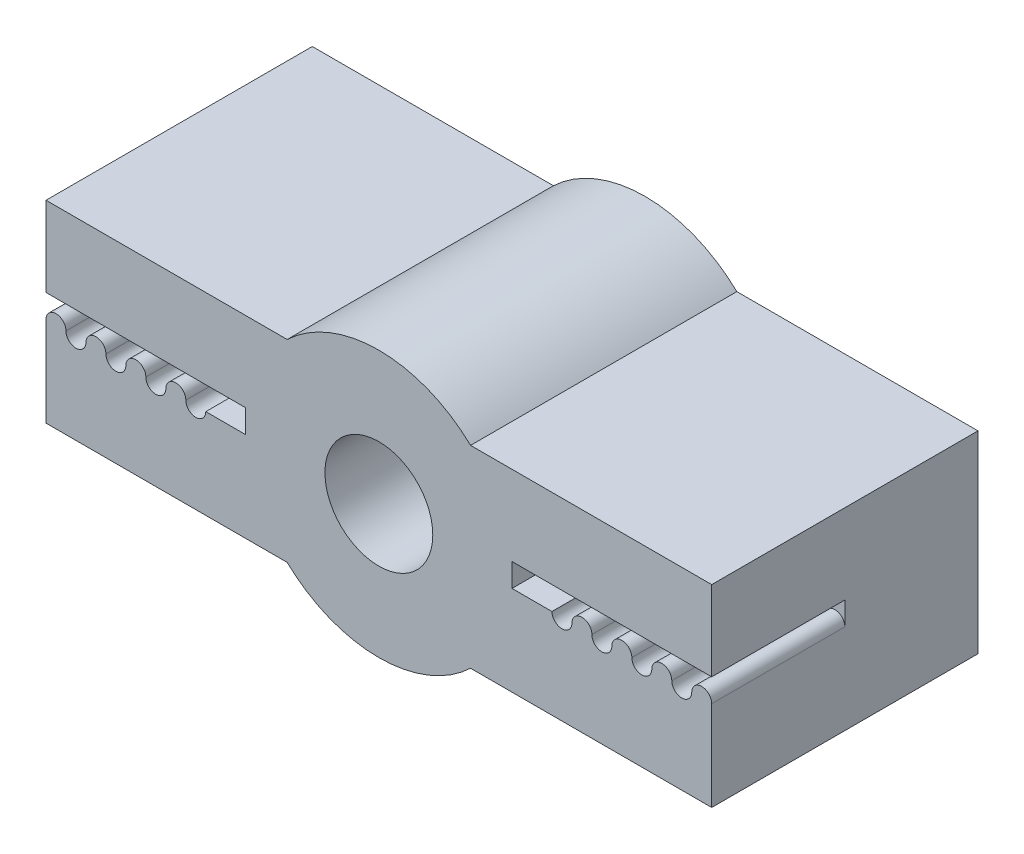
ISO-10303-21;
HEADER;
FILE_DESCRIPTION(('STEP AP214'),'2;1');
FILE_NAME('part.step','',(''),(''),'','','');
FILE_SCHEMA(('AUTOMOTIVE_DESIGN { 1 0 10303 214 1 1 1 1 }'));
ENDSEC;
DATA;
#1=APPLICATION_CONTEXT('core data for automotive mechanical design processes');
#2=APPLICATION_PROTOCOL_DEFINITION('international standard','automotive_design',2000,#1);
#3=PRODUCT_CONTEXT('',#1,'mechanical');
#4=PRODUCT('Part','Part','',(#3));
#5=PRODUCT_RELATED_PRODUCT_CATEGORY('part','',(#4));
#6=PRODUCT_DEFINITION_FORMATION('','',#4);
#7=PRODUCT_DEFINITION_CONTEXT('part definition',#1,'design');
#8=PRODUCT_DEFINITION('design','',#6,#7);
#9=PRODUCT_DEFINITION_SHAPE('','',#8);
#10=(LENGTH_UNIT() NAMED_UNIT(*) SI_UNIT(.MILLI.,.METRE.));
#11=(NAMED_UNIT(*) PLANE_ANGLE_UNIT() SI_UNIT($,.RADIAN.));
#12=(NAMED_UNIT(*) SI_UNIT($,.STERADIAN.) SOLID_ANGLE_UNIT());
#13=UNCERTAINTY_MEASURE_WITH_UNIT(LENGTH_MEASURE(1.E-05),#10,'distance_accuracy_value','');
#14=(GEOMETRIC_REPRESENTATION_CONTEXT(3) GLOBAL_UNCERTAINTY_ASSIGNED_CONTEXT((#13)) GLOBAL_UNIT_ASSIGNED_CONTEXT((#10,
#11,#12)) REPRESENTATION_CONTEXT('',''));
#15=CARTESIAN_POINT('',(0.,0.,0.));
#16=DIRECTION('',(0.,0.,1.));
#17=DIRECTION('',(1.,0.,0.));
#18=AXIS2_PLACEMENT_3D('',#15,#16,#17);
#19=CARTESIAN_POINT('',(45.,8.75000000000001,35.));
#20=DIRECTION('',(-1.,0.,0.));
#21=DIRECTION('',(0.,0.,1.));
#22=AXIS2_PLACEMENT_3D('',#19,#20,#21);
#23=PLANE('',#22);
#24=DIRECTION('',(0.,0.,1.));
#25=VECTOR('',#24,1.);
#26=CARTESIAN_POINT('',(45.,15.5,25.));
#27=LINE('',#26,#25);
#28=CARTESIAN_POINT('',(45.,15.5,25.));
#29=VERTEX_POINT('',#28);
#30=CARTESIAN_POINT('',(45.,15.5,35.));
#31=VERTEX_POINT('',#30);
#32=EDGE_CURVE('E383',#29,#31,#27,.T.);
#33=ORIENTED_EDGE('',*,*,#32,.T.);
#34=DIRECTION('',(0.,1.,0.));
#35=VECTOR('',#34,1.);
#36=CARTESIAN_POINT('',(45.,8.75000000000001,35.));
#37=LINE('',#36,#35);
#38=CARTESIAN_POINT('',(45.,8.75000000000001,35.));
#39=VERTEX_POINT('',#38);
#40=EDGE_CURVE('E449',#39,#31,#37,.T.);
#41=ORIENTED_EDGE('',*,*,#40,.F.);
#42=DIRECTION('',(0.,0.,-1.));
#43=VECTOR('',#42,1.);
#44=CARTESIAN_POINT('',(45.,8.75000000000001,35.));
#45=LINE('',#44,#43);
#46=CARTESIAN_POINT('',(45.,8.75000000000001,15.));
#47=VERTEX_POINT('',#46);
#48=EDGE_CURVE('E43',#39,#47,#45,.T.);
#49=ORIENTED_EDGE('',*,*,#48,.T.);
#50=DIRECTION('',(0.,1.,0.));
#51=VECTOR('',#50,1.);
#52=CARTESIAN_POINT('',(45.,8.75000000000001,15.));
#53=LINE('',#52,#51);
#54=CARTESIAN_POINT('',(45.,23.25,15.));
#55=VERTEX_POINT('',#54);
#56=EDGE_CURVE('E469',#47,#55,#53,.T.);
#57=ORIENTED_EDGE('',*,*,#56,.T.);
#58=DIRECTION('',(0.,0.,-1.));
#59=VECTOR('',#58,1.);
#60=CARTESIAN_POINT('',(45.,23.25,35.));
#61=LINE('',#60,#59);
#62=CARTESIAN_POINT('',(45.,23.25,35.));
#63=VERTEX_POINT('',#62);
#64=EDGE_CURVE('E494',#63,#55,#61,.T.);
#65=ORIENTED_EDGE('',*,*,#64,.F.);
#66=CARTESIAN_POINT('',(45.,17.25,35.));
#67=VERTEX_POINT('',#66);
#68=EDGE_CURVE('E448',#67,#63,#37,.T.);
#69=ORIENTED_EDGE('',*,*,#68,.F.);
#70=DIRECTION('',(0.,0.,1.));
#71=VECTOR('',#70,1.);
#72=CARTESIAN_POINT('',(45.,17.25,25.));
#73=LINE('',#72,#71);
#74=CARTESIAN_POINT('',(45.,17.25,25.));
#75=VERTEX_POINT('',#74);
#76=EDGE_CURVE('E58',#75,#67,#73,.T.);
#77=ORIENTED_EDGE('',*,*,#76,.F.);
#78=DIRECTION('',(0.,1.,0.));
#79=VECTOR('',#78,1.);
#80=CARTESIAN_POINT('',(45.,15.5,25.));
#81=LINE('',#80,#79);
#82=EDGE_CURVE('E349',#29,#75,#81,.T.);
#83=ORIENTED_EDGE('',*,*,#82,.F.);
#84=EDGE_LOOP('',(#33,#41,#49,#57,#65,#69,#77,#83));
#85=FACE_BOUND('',#84,.T.);
#86=ADVANCED_FACE('F35',(#85),#23,.F.);
#87=CARTESIAN_POINT('',(20.,16.,35.));
#88=DIRECTION('',(0.,0.,-1.));
#89=DIRECTION('',(-1.,0.,0.));
#90=AXIS2_PLACEMENT_3D('',#87,#88,#89);
#91=CYLINDRICAL_SURFACE('',#90,10.);
#92=CARTESIAN_POINT('',(20.,16.,15.));
#93=DIRECTION('',(0.,0.,1.));
#94=DIRECTION('',(1.,0.,0.));
#95=AXIS2_PLACEMENT_3D('',#92,#93,#94);
#96=CIRCLE('',#95,10.);
#97=CARTESIAN_POINT('',(13.112511343022,8.75000000000001,15.));
#98=VERTEX_POINT('',#97);
#99=CARTESIAN_POINT('',(26.887488656978,8.75000000000001,15.));
#100=VERTEX_POINT('',#99);
#101=EDGE_CURVE('E441',#98,#100,#96,.T.);
#102=ORIENTED_EDGE('',*,*,#101,.T.);
#103=DIRECTION('',(0.,0.,-1.));
#104=VECTOR('',#103,1.);
#105=CARTESIAN_POINT('',(26.887488656978,8.75000000000001,35.));
#106=LINE('',#105,#104);
#107=CARTESIAN_POINT('',(26.887488656978,8.75000000000001,35.));
#108=VERTEX_POINT('',#107);
#109=EDGE_CURVE('E11',#108,#100,#106,.T.);
#110=ORIENTED_EDGE('',*,*,#109,.F.);
#111=CARTESIAN_POINT('',(20.,16.,35.));
#112=DIRECTION('',(0.,0.,1.));
#113=DIRECTION('',(1.,0.,0.));
#114=AXIS2_PLACEMENT_3D('',#111,#112,#113);
#115=CIRCLE('',#114,10.);
#116=CARTESIAN_POINT('',(13.112511343022,8.75000000000001,35.));
#117=VERTEX_POINT('',#116);
#118=EDGE_CURVE('E442',#117,#108,#115,.T.);
#119=ORIENTED_EDGE('',*,*,#118,.F.);
#120=DIRECTION('',(0.,0.,-1.));
#121=VECTOR('',#120,1.);
#122=CARTESIAN_POINT('',(13.112511343022,8.75000000000001,35.));
#123=LINE('',#122,#121);
#124=EDGE_CURVE('E464',#117,#98,#123,.T.);
#125=ORIENTED_EDGE('',*,*,#124,.T.);
#126=EDGE_LOOP('',(#102,#110,#119,#125));
#127=FACE_BOUND('',#126,.T.);
#128=ADVANCED_FACE('F37',(#127),#91,.T.);
#129=CARTESIAN_POINT('',(26.887488656978,8.75000000000001,35.));
#130=DIRECTION('',(0.,1.,0.));
#131=DIRECTION('',(-1.,0.,0.));
#132=AXIS2_PLACEMENT_3D('',#129,#130,#131);
#133=PLANE('',#132);
#134=DIRECTION('',(1.,0.,0.));
#135=VECTOR('',#134,1.);
#136=CARTESIAN_POINT('',(26.887488656978,8.75000000000001,15.));
#137=LINE('',#136,#135);
#138=EDGE_CURVE('E467',#100,#47,#137,.T.);
#139=ORIENTED_EDGE('',*,*,#138,.T.);
#140=ORIENTED_EDGE('',*,*,#48,.F.);
#141=DIRECTION('',(1.,0.,0.));
#142=VECTOR('',#141,1.);
#143=CARTESIAN_POINT('',(26.887488656978,8.75000000000001,35.));
#144=LINE('',#143,#142);
#145=EDGE_CURVE('E445',#108,#39,#144,.T.);
#146=ORIENTED_EDGE('',*,*,#145,.F.);
#147=ORIENTED_EDGE('',*,*,#109,.T.);
#148=EDGE_LOOP('',(#139,#140,#146,#147));
#149=FACE_BOUND('',#148,.T.);
#150=ADVANCED_FACE('F536',(#149),#133,.F.);
#151=CARTESIAN_POINT('',(26.887488656978,23.25,35.));
#152=DIRECTION('',(0.,-1.,0.));
#153=DIRECTION('',(1.,0.,0.));
#154=AXIS2_PLACEMENT_3D('',#151,#152,#153);
#155=PLANE('',#154);
#156=DIRECTION('',(-1.,0.,0.));
#157=VECTOR('',#156,1.);
#158=CARTESIAN_POINT('',(26.887488656978,23.25,15.));
#159=LINE('',#158,#157);
#160=CARTESIAN_POINT('',(26.887488656978,23.25,15.));
#161=VERTEX_POINT('',#160);
#162=EDGE_CURVE('E471',#55,#161,#159,.T.);
#163=ORIENTED_EDGE('',*,*,#162,.T.);
#164=DIRECTION('',(0.,0.,-1.));
#165=VECTOR('',#164,1.);
#166=CARTESIAN_POINT('',(26.887488656978,23.25,35.));
#167=LINE('',#166,#165);
#168=CARTESIAN_POINT('',(26.887488656978,23.25,35.));
#169=VERTEX_POINT('',#168);
#170=EDGE_CURVE('E491',#169,#161,#167,.T.);
#171=ORIENTED_EDGE('',*,*,#170,.F.);
#172=DIRECTION('',(-1.,0.,0.));
#173=VECTOR('',#172,1.);
#174=CARTESIAN_POINT('',(26.887488656978,23.25,35.));
#175=LINE('',#174,#173);
#176=EDGE_CURVE('E452',#63,#169,#175,.T.);
#177=ORIENTED_EDGE('',*,*,#176,.F.);
#178=ORIENTED_EDGE('',*,*,#64,.T.);
#179=EDGE_LOOP('',(#163,#171,#177,#178));
#180=FACE_BOUND('',#179,.T.);
#181=ADVANCED_FACE('F511',(#180),#155,.F.);
#182=CARTESIAN_POINT('',(20.,16.,35.));
#183=DIRECTION('',(0.,0.,-1.));
#184=DIRECTION('',(-1.,0.,0.));
#185=AXIS2_PLACEMENT_3D('',#182,#183,#184);
#186=CYLINDRICAL_SURFACE('',#185,10.);
#187=CARTESIAN_POINT('',(20.,16.,15.));
#188=DIRECTION('',(0.,0.,1.));
#189=DIRECTION('',(1.,0.,0.));
#190=AXIS2_PLACEMENT_3D('',#187,#188,#189);
#191=CIRCLE('',#190,10.);
#192=CARTESIAN_POINT('',(13.112511343022,23.25,15.));
#193=VERTEX_POINT('',#192);
#194=EDGE_CURVE('E473',#161,#193,#191,.T.);
#195=ORIENTED_EDGE('',*,*,#194,.T.);
#196=DIRECTION('',(0.,0.,-1.));
#197=VECTOR('',#196,1.);
#198=CARTESIAN_POINT('',(13.112511343022,23.25,35.));
#199=LINE('',#198,#197);
#200=CARTESIAN_POINT('',(13.112511343022,23.25,35.));
#201=VERTEX_POINT('',#200);
#202=EDGE_CURVE('E488',#201,#193,#199,.T.);
#203=ORIENTED_EDGE('',*,*,#202,.F.);
#204=CARTESIAN_POINT('',(20.,16.,35.));
#205=DIRECTION('',(0.,0.,1.));
#206=DIRECTION('',(1.,0.,0.));
#207=AXIS2_PLACEMENT_3D('',#204,#205,#206);
#208=CIRCLE('',#207,10.);
#209=EDGE_CURVE('E454',#169,#201,#208,.T.);
#210=ORIENTED_EDGE('',*,*,#209,.F.);
#211=ORIENTED_EDGE('',*,*,#170,.T.);
#212=EDGE_LOOP('',(#195,#203,#210,#211));
#213=FACE_BOUND('',#212,.T.);
#214=ADVANCED_FACE('F515',(#213),#186,.T.);
#215=CARTESIAN_POINT('',(-4.99999999999997,23.25,35.));
#216=DIRECTION('',(0.,-1.,0.));
#217=DIRECTION('',(1.,0.,0.));
#218=AXIS2_PLACEMENT_3D('',#215,#216,#217);
#219=PLANE('',#218);
#220=DIRECTION('',(-1.,0.,0.));
#221=VECTOR('',#220,1.);
#222=CARTESIAN_POINT('',(-4.99999999999997,23.25,15.));
#223=LINE('',#222,#221);
#224=CARTESIAN_POINT('',(-4.99999999999997,23.25,15.));
#225=VERTEX_POINT('',#224);
#226=EDGE_CURVE('E475',#193,#225,#223,.T.);
#227=ORIENTED_EDGE('',*,*,#226,.T.);
#228=DIRECTION('',(0.,0.,-1.));
#229=VECTOR('',#228,1.);
#230=CARTESIAN_POINT('',(-4.99999999999997,23.25,35.));
#231=LINE('',#230,#229);
#232=CARTESIAN_POINT('',(-4.99999999999997,23.25,35.));
#233=VERTEX_POINT('',#232);
#234=EDGE_CURVE('E485',#233,#225,#231,.T.);
#235=ORIENTED_EDGE('',*,*,#234,.F.);
#236=DIRECTION('',(-1.,0.,0.));
#237=VECTOR('',#236,1.);
#238=CARTESIAN_POINT('',(-4.99999999999997,23.25,35.));
#239=LINE('',#238,#237);
#240=EDGE_CURVE('E456',#201,#233,#239,.T.);
#241=ORIENTED_EDGE('',*,*,#240,.F.);
#242=ORIENTED_EDGE('',*,*,#202,.T.);
#243=EDGE_LOOP('',(#227,#235,#241,#242));
#244=FACE_BOUND('',#243,.T.);
#245=ADVANCED_FACE('F550',(#244),#219,.F.);
#246=CARTESIAN_POINT('',(-4.99999999999996,8.75000000000001,35.));
#247=DIRECTION('',(1.,0.,0.));
#248=DIRECTION('',(0.,1.,0.));
#249=AXIS2_PLACEMENT_3D('',#246,#247,#248);
#250=PLANE('',#249);
#251=DIRECTION('',(0.,-1.,0.));
#252=VECTOR('',#251,1.);
#253=CARTESIAN_POINT('',(-4.99999999999996,8.75000000000001,35.));
#254=LINE('',#253,#252);
#255=CARTESIAN_POINT('',(-4.99999999999997,15.5,35.));
#256=VERTEX_POINT('',#255);
#257=CARTESIAN_POINT('',(-4.99999999999996,8.75000000000001,35.));
#258=VERTEX_POINT('',#257);
#259=EDGE_CURVE('E458',#256,#258,#254,.T.);
#260=ORIENTED_EDGE('',*,*,#259,.F.);
#261=DIRECTION('',(0.,0.,1.));
#262=VECTOR('',#261,1.);
#263=CARTESIAN_POINT('',(-4.99999999999997,15.5,25.));
#264=LINE('',#263,#262);
#265=CARTESIAN_POINT('',(-4.99999999999997,15.5,25.));
#266=VERTEX_POINT('',#265);
#267=EDGE_CURVE('E323',#266,#256,#264,.T.);
#268=ORIENTED_EDGE('',*,*,#267,.F.);
#269=DIRECTION('',(0.,-1.,0.));
#270=VECTOR('',#269,1.);
#271=CARTESIAN_POINT('',(-4.99999999999997,15.5,25.));
#272=LINE('',#271,#270);
#273=CARTESIAN_POINT('',(-4.99999999999996,17.25,25.));
#274=VERTEX_POINT('',#273);
#275=EDGE_CURVE('E252',#274,#266,#272,.T.);
#276=ORIENTED_EDGE('',*,*,#275,.F.);
#277=DIRECTION('',(0.,0.,1.));
#278=VECTOR('',#277,1.);
#279=CARTESIAN_POINT('',(-4.99999999999996,17.25,25.));
#280=LINE('',#279,#278);
#281=CARTESIAN_POINT('',(-4.99999999999996,17.25,35.));
#282=VERTEX_POINT('',#281);
#283=EDGE_CURVE('E326',#274,#282,#280,.T.);
#284=ORIENTED_EDGE('',*,*,#283,.T.);
#285=EDGE_CURVE('E459',#233,#282,#254,.T.);
#286=ORIENTED_EDGE('',*,*,#285,.F.);
#287=ORIENTED_EDGE('',*,*,#234,.T.);
#288=DIRECTION('',(0.,-1.,0.));
#289=VECTOR('',#288,1.);
#290=CARTESIAN_POINT('',(-4.99999999999996,8.75000000000001,15.));
#291=LINE('',#290,#289);
#292=CARTESIAN_POINT('',(-4.99999999999996,8.75000000000001,15.));
#293=VERTEX_POINT('',#292);
#294=EDGE_CURVE('E477',#225,#293,#291,.T.);
#295=ORIENTED_EDGE('',*,*,#294,.T.);
#296=DIRECTION('',(0.,0.,-1.));
#297=VECTOR('',#296,1.);
#298=CARTESIAN_POINT('',(-4.99999999999996,8.75000000000001,35.));
#299=LINE('',#298,#297);
#300=EDGE_CURVE('E482',#258,#293,#299,.T.);
#301=ORIENTED_EDGE('',*,*,#300,.F.);
#302=EDGE_LOOP('',(#260,#268,#276,#284,#286,#287,#295,#301));
#303=FACE_BOUND('',#302,.T.);
#304=ADVANCED_FACE('F547',(#303),#250,.F.);
#305=CARTESIAN_POINT('',(-4.99999999999996,8.75000000000001,35.));
#306=DIRECTION('',(0.,1.,0.));
#307=DIRECTION('',(-1.,0.,0.));
#308=AXIS2_PLACEMENT_3D('',#305,#306,#307);
#309=PLANE('',#308);
#310=DIRECTION('',(1.,0.,0.));
#311=VECTOR('',#310,1.);
#312=CARTESIAN_POINT('',(-4.99999999999996,8.75000000000001,15.));
#313=LINE('',#312,#311);
#314=EDGE_CURVE('E446',#293,#98,#313,.T.);
#315=ORIENTED_EDGE('',*,*,#314,.T.);
#316=ORIENTED_EDGE('',*,*,#124,.F.);
#317=DIRECTION('',(1.,0.,0.));
#318=VECTOR('',#317,1.);
#319=CARTESIAN_POINT('',(-4.99999999999996,8.75000000000001,35.));
#320=LINE('',#319,#318);
#321=EDGE_CURVE('E462',#258,#117,#320,.T.);
#322=ORIENTED_EDGE('',*,*,#321,.F.);
#323=ORIENTED_EDGE('',*,*,#300,.T.);
#324=EDGE_LOOP('',(#315,#316,#322,#323));
#325=FACE_BOUND('',#324,.T.);
#326=ADVANCED_FACE('F542',(#325),#309,.F.);
#327=CARTESIAN_POINT('',(20.,16.,35.));
#328=DIRECTION('',(0.,0.,1.));
#329=DIRECTION('',(1.,0.,0.));
#330=AXIS2_PLACEMENT_3D('',#327,#328,#329);
#331=PLANE('',#330);
#332=CARTESIAN_POINT('',(-4.24999999999997,15.5,35.));
#333=DIRECTION('',(0.,0.,-1.));
#334=DIRECTION('',(1.,0.,0.));
#335=AXIS2_PLACEMENT_3D('',#332,#333,#334);
#336=CIRCLE('',#335,0.75);
#337=CARTESIAN_POINT('',(-3.49999999999997,15.5,35.));
#338=VERTEX_POINT('',#337);
#339=EDGE_CURVE('E50',#256,#338,#336,.T.);
#340=ORIENTED_EDGE('',*,*,#339,.F.);
#341=ORIENTED_EDGE('',*,*,#259,.T.);
#342=ORIENTED_EDGE('',*,*,#321,.T.);
#343=ORIENTED_EDGE('',*,*,#118,.T.);
#344=ORIENTED_EDGE('',*,*,#145,.T.);
#345=ORIENTED_EDGE('',*,*,#40,.T.);
#346=CARTESIAN_POINT('',(44.25,15.5,35.));
#347=DIRECTION('',(0.,0.,-1.));
#348=DIRECTION('',(-1.,0.,0.));
#349=AXIS2_PLACEMENT_3D('',#346,#347,#348);
#350=CIRCLE('',#349,0.750000000000004);
#351=CARTESIAN_POINT('',(43.5,15.5,35.));
#352=VERTEX_POINT('',#351);
#353=EDGE_CURVE('E384',#352,#31,#350,.T.);
#354=ORIENTED_EDGE('',*,*,#353,.F.);
#355=CARTESIAN_POINT('',(42.75,15.5,35.));
#356=DIRECTION('',(0.,0.,1.));
#357=DIRECTION('',(-1.,0.,0.));
#358=AXIS2_PLACEMENT_3D('',#355,#356,#357);
#359=CIRCLE('',#358,0.749999999999997);
#360=CARTESIAN_POINT('',(42.,15.5,35.));
#361=VERTEX_POINT('',#360);
#362=EDGE_CURVE('E350',#361,#352,#359,.T.);
#363=ORIENTED_EDGE('',*,*,#362,.F.);
#364=CARTESIAN_POINT('',(41.25,15.5,35.));
#365=DIRECTION('',(0.,0.,-1.));
#366=DIRECTION('',(-1.,0.,0.));
#367=AXIS2_PLACEMENT_3D('',#364,#365,#366);
#368=CIRCLE('',#367,0.750000000000001);
#369=CARTESIAN_POINT('',(40.5,15.5,35.));
#370=VERTEX_POINT('',#369);
#371=EDGE_CURVE('E409',#370,#361,#368,.T.);
#372=ORIENTED_EDGE('',*,*,#371,.F.);
#373=CARTESIAN_POINT('',(39.75,15.5,35.));
#374=DIRECTION('',(0.,0.,1.));
#375=DIRECTION('',(-1.,0.,0.));
#376=AXIS2_PLACEMENT_3D('',#373,#374,#375);
#377=CIRCLE('',#376,0.749999999999997);
#378=CARTESIAN_POINT('',(39.,15.5,35.));
#379=VERTEX_POINT('',#378);
#380=EDGE_CURVE('E406',#379,#370,#377,.T.);
#381=ORIENTED_EDGE('',*,*,#380,.F.);
#382=CARTESIAN_POINT('',(38.25,15.5,35.));
#383=DIRECTION('',(0.,0.,-1.));
#384=DIRECTION('',(-1.,0.,0.));
#385=AXIS2_PLACEMENT_3D('',#382,#383,#384);
#386=CIRCLE('',#385,0.750000000000004);
#387=CARTESIAN_POINT('',(37.5,15.5,35.));
#388=VERTEX_POINT('',#387);
#389=EDGE_CURVE('E403',#388,#379,#386,.T.);
#390=ORIENTED_EDGE('',*,*,#389,.F.);
#391=CARTESIAN_POINT('',(36.75,15.5,35.));
#392=DIRECTION('',(0.,0.,1.));
#393=DIRECTION('',(-1.,0.,0.));
#394=AXIS2_PLACEMENT_3D('',#391,#392,#393);
#395=CIRCLE('',#394,0.750000000000001);
#396=CARTESIAN_POINT('',(36.,15.5,35.));
#397=VERTEX_POINT('',#396);
#398=EDGE_CURVE('E400',#397,#388,#395,.T.);
#399=ORIENTED_EDGE('',*,*,#398,.F.);
#400=CARTESIAN_POINT('',(35.25,15.5,35.));
#401=DIRECTION('',(0.,0.,-1.));
#402=DIRECTION('',(-1.,0.,0.));
#403=AXIS2_PLACEMENT_3D('',#400,#401,#402);
#404=CIRCLE('',#403,0.749999999999997);
#405=CARTESIAN_POINT('',(34.5,15.5,35.));
#406=VERTEX_POINT('',#405);
#407=EDGE_CURVE('E397',#406,#397,#404,.T.);
#408=ORIENTED_EDGE('',*,*,#407,.F.);
#409=CARTESIAN_POINT('',(33.75,15.5,35.));
#410=DIRECTION('',(0.,0.,1.));
#411=DIRECTION('',(-1.,0.,0.));
#412=AXIS2_PLACEMENT_3D('',#409,#410,#411);
#413=CIRCLE('',#412,0.750000000000001);
#414=CARTESIAN_POINT('',(33.,15.5,35.));
#415=VERTEX_POINT('',#414);
#416=EDGE_CURVE('E394',#415,#406,#413,.T.);
#417=ORIENTED_EDGE('',*,*,#416,.F.);
#418=DIRECTION('',(1.,0.,0.));
#419=VECTOR('',#418,1.);
#420=CARTESIAN_POINT('',(30.,15.5,35.));
#421=LINE('',#420,#419);
#422=CARTESIAN_POINT('',(30.,15.5,35.));
#423=VERTEX_POINT('',#422);
#424=EDGE_CURVE('E391',#423,#415,#421,.T.);
#425=ORIENTED_EDGE('',*,*,#424,.F.);
#426=DIRECTION('',(0.,-1.,0.));
#427=VECTOR('',#426,1.);
#428=CARTESIAN_POINT('',(30.,17.25,35.));
#429=LINE('',#428,#427);
#430=CARTESIAN_POINT('',(30.,17.25,35.));
#431=VERTEX_POINT('',#430);
#432=EDGE_CURVE('E388',#431,#423,#429,.T.);
#433=ORIENTED_EDGE('',*,*,#432,.F.);
#434=DIRECTION('',(-1.,0.,0.));
#435=VECTOR('',#434,1.);
#436=CARTESIAN_POINT('',(45.,17.25,35.));
#437=LINE('',#436,#435);
#438=EDGE_CURVE('E386',#67,#431,#437,.T.);
#439=ORIENTED_EDGE('',*,*,#438,.F.);
#440=ORIENTED_EDGE('',*,*,#68,.T.);
#441=ORIENTED_EDGE('',*,*,#176,.T.);
#442=ORIENTED_EDGE('',*,*,#209,.T.);
#443=ORIENTED_EDGE('',*,*,#240,.T.);
#444=ORIENTED_EDGE('',*,*,#285,.T.);
#445=DIRECTION('',(-1.,0.,0.));
#446=VECTOR('',#445,1.);
#447=CARTESIAN_POINT('',(-4.99999999999996,17.25,35.));
#448=LINE('',#447,#446);
#449=CARTESIAN_POINT('',(10.,17.25,35.));
#450=VERTEX_POINT('',#449);
#451=EDGE_CURVE('E266',#450,#282,#448,.T.);
#452=ORIENTED_EDGE('',*,*,#451,.F.);
#453=DIRECTION('',(0.,1.,0.));
#454=VECTOR('',#453,1.);
#455=CARTESIAN_POINT('',(10.,17.25,35.));
#456=LINE('',#455,#454);
#457=CARTESIAN_POINT('',(10.,15.5,35.));
#458=VERTEX_POINT('',#457);
#459=EDGE_CURVE('E268',#458,#450,#456,.T.);
#460=ORIENTED_EDGE('',*,*,#459,.F.);
#461=DIRECTION('',(1.,0.,0.));
#462=VECTOR('',#461,1.);
#463=CARTESIAN_POINT('',(10.,15.5,35.));
#464=LINE('',#463,#462);
#465=CARTESIAN_POINT('',(7.00000000000003,15.5,35.));
#466=VERTEX_POINT('',#465);
#467=EDGE_CURVE('E318',#466,#458,#464,.T.);
#468=ORIENTED_EDGE('',*,*,#467,.F.);
#469=CARTESIAN_POINT('',(6.25000000000003,15.5,35.));
#470=DIRECTION('',(0.,0.,1.));
#471=DIRECTION('',(1.,0.,0.));
#472=AXIS2_PLACEMENT_3D('',#469,#470,#471);
#473=CIRCLE('',#472,0.749999999999999);
#474=CARTESIAN_POINT('',(5.50000000000003,15.5,35.));
#475=VERTEX_POINT('',#474);
#476=EDGE_CURVE('E315',#475,#466,#473,.T.);
#477=ORIENTED_EDGE('',*,*,#476,.F.);
#478=CARTESIAN_POINT('',(4.75000000000003,15.5,35.));
#479=DIRECTION('',(0.,0.,-1.));
#480=DIRECTION('',(1.,0.,0.));
#481=AXIS2_PLACEMENT_3D('',#478,#479,#480);
#482=CIRCLE('',#481,0.75);
#483=CARTESIAN_POINT('',(4.00000000000003,15.5,35.));
#484=VERTEX_POINT('',#483);
#485=EDGE_CURVE('E312',#484,#475,#482,.T.);
#486=ORIENTED_EDGE('',*,*,#485,.F.);
#487=CARTESIAN_POINT('',(3.25000000000003,15.5,35.));
#488=DIRECTION('',(0.,0.,1.));
#489=DIRECTION('',(1.,0.,0.));
#490=AXIS2_PLACEMENT_3D('',#487,#488,#489);
#491=CIRCLE('',#490,0.75);
#492=CARTESIAN_POINT('',(2.50000000000003,15.5,35.));
#493=VERTEX_POINT('',#492);
#494=EDGE_CURVE('E309',#493,#484,#491,.T.);
#495=ORIENTED_EDGE('',*,*,#494,.F.);
#496=CARTESIAN_POINT('',(1.75000000000003,15.5,35.));
#497=DIRECTION('',(0.,0.,-1.));
#498=DIRECTION('',(1.,0.,0.));
#499=AXIS2_PLACEMENT_3D('',#496,#497,#498);
#500=CIRCLE('',#499,0.75);
#501=CARTESIAN_POINT('',(1.00000000000003,15.5,35.));
#502=VERTEX_POINT('',#501);
#503=EDGE_CURVE('E306',#502,#493,#500,.T.);
#504=ORIENTED_EDGE('',*,*,#503,.F.);
#505=CARTESIAN_POINT('',(0.250000000000034,15.5,35.));
#506=DIRECTION('',(0.,0.,1.));
#507=DIRECTION('',(1.,0.,0.));
#508=AXIS2_PLACEMENT_3D('',#505,#506,#507);
#509=CIRCLE('',#508,0.75);
#510=CARTESIAN_POINT('',(-0.499999999999966,15.5,35.));
#511=VERTEX_POINT('',#510);
#512=EDGE_CURVE('E303',#511,#502,#509,.T.);
#513=ORIENTED_EDGE('',*,*,#512,.F.);
#514=CARTESIAN_POINT('',(-1.24999999999997,15.5,35.));
#515=DIRECTION('',(0.,0.,-1.));
#516=DIRECTION('',(1.,0.,0.));
#517=AXIS2_PLACEMENT_3D('',#514,#515,#516);
#518=CIRCLE('',#517,0.75);
#519=CARTESIAN_POINT('',(-1.99999999999997,15.5,35.));
#520=VERTEX_POINT('',#519);
#521=EDGE_CURVE('E300',#520,#511,#518,.T.);
#522=ORIENTED_EDGE('',*,*,#521,.F.);
#523=CARTESIAN_POINT('',(-2.74999999999997,15.5,35.));
#524=DIRECTION('',(0.,0.,1.));
#525=DIRECTION('',(1.,0.,0.));
#526=AXIS2_PLACEMENT_3D('',#523,#524,#525);
#527=CIRCLE('',#526,0.75);
#528=EDGE_CURVE('E297',#338,#520,#527,.T.);
#529=ORIENTED_EDGE('',*,*,#528,.F.);
#530=EDGE_LOOP('',(#340,#341,#342,#343,#344,#345,#354,#363,#372,#381,#390,#399,#408,#417,#425,
#433,#439,#440,#441,#442,#443,#444,#452,#460,#468,#477,#486,#495,#504,#513,#522,#529));
#531=FACE_BOUND('',#530,.T.);
#532=CARTESIAN_POINT('',(20.,16.,35.));
#533=DIRECTION('',(0.,0.,1.));
#534=DIRECTION('',(1.,0.,0.));
#535=AXIS2_PLACEMENT_3D('',#532,#533,#534);
#536=CIRCLE('',#535,4.05);
#537=CARTESIAN_POINT('',(24.05,16.,35.));
#538=VERTEX_POINT('',#537);
#539=EDGE_CURVE('E438',#538,#538,#536,.T.);
#540=ORIENTED_EDGE('',*,*,#539,.F.);
#541=EDGE_LOOP('',(#540));
#542=FACE_BOUND('',#541,.T.);
#543=ADVANCED_FACE('F519',(#531,#542),#331,.T.);
#544=CARTESIAN_POINT('',(20.,16.,15.));
#545=DIRECTION('',(0.,0.,1.));
#546=DIRECTION('',(1.,0.,0.));
#547=AXIS2_PLACEMENT_3D('',#544,#545,#546);
#548=PLANE('',#547);
#549=CARTESIAN_POINT('',(20.,16.,15.));
#550=DIRECTION('',(0.,0.,1.));
#551=DIRECTION('',(1.,0.,0.));
#552=AXIS2_PLACEMENT_3D('',#549,#550,#551);
#553=CIRCLE('',#552,4.05);
#554=CARTESIAN_POINT('',(24.05,16.,15.));
#555=VERTEX_POINT('',#554);
#556=EDGE_CURVE('E325',#555,#555,#553,.T.);
#557=ORIENTED_EDGE('',*,*,#556,.T.);
#558=EDGE_LOOP('',(#557));
#559=FACE_BOUND('',#558,.T.);
#560=ORIENTED_EDGE('',*,*,#101,.F.);
#561=ORIENTED_EDGE('',*,*,#314,.F.);
#562=ORIENTED_EDGE('',*,*,#294,.F.);
#563=ORIENTED_EDGE('',*,*,#226,.F.);
#564=ORIENTED_EDGE('',*,*,#194,.F.);
#565=ORIENTED_EDGE('',*,*,#162,.F.);
#566=ORIENTED_EDGE('',*,*,#56,.F.);
#567=ORIENTED_EDGE('',*,*,#138,.F.);
#568=EDGE_LOOP('',(#560,#561,#562,#563,#564,#565,#566,#567));
#569=FACE_BOUND('',#568,.T.);
#570=ADVANCED_FACE('F506',(#559,#569),#548,.F.);
#571=CARTESIAN_POINT('',(20.,16.,35.));
#572=DIRECTION('',(0.,0.,1.));
#573=DIRECTION('',(1.,0.,0.));
#574=AXIS2_PLACEMENT_3D('',#571,#572,#573);
#575=CYLINDRICAL_SURFACE('',#574,4.05);
#576=ORIENTED_EDGE('',*,*,#556,.F.);
#577=EDGE_LOOP('',(#576));
#578=FACE_BOUND('',#577,.T.);
#579=ORIENTED_EDGE('',*,*,#539,.T.);
#580=EDGE_LOOP('',(#579));
#581=FACE_BOUND('',#580,.T.);
#582=ADVANCED_FACE('F599',(#578,#581),#575,.F.);
#583=CARTESIAN_POINT('',(44.25,15.5,25.));
#584=DIRECTION('',(0.,0.,1.));
#585=DIRECTION('',(1.,0.,0.));
#586=AXIS2_PLACEMENT_3D('',#583,#584,#585);
#587=CYLINDRICAL_SURFACE('',#586,0.750000000000004);
#588=ORIENTED_EDGE('',*,*,#353,.T.);
#589=ORIENTED_EDGE('',*,*,#32,.F.);
#590=CARTESIAN_POINT('',(44.25,15.5,25.));
#591=DIRECTION('',(0.,0.,-1.));
#592=DIRECTION('',(-1.,0.,0.));
#593=AXIS2_PLACEMENT_3D('',#590,#591,#592);
#594=CIRCLE('',#593,0.750000000000004);
#595=CARTESIAN_POINT('',(43.5,15.5,25.));
#596=VERTEX_POINT('',#595);
#597=EDGE_CURVE('E346',#596,#29,#594,.T.);
#598=ORIENTED_EDGE('',*,*,#597,.F.);
#599=DIRECTION('',(0.,0.,1.));
#600=VECTOR('',#599,1.);
#601=CARTESIAN_POINT('',(43.5,15.5,25.));
#602=LINE('',#601,#600);
#603=EDGE_CURVE('E298',#596,#352,#602,.T.);
#604=ORIENTED_EDGE('',*,*,#603,.T.);
#605=EDGE_LOOP('',(#588,#589,#598,#604));
#606=FACE_BOUND('',#605,.T.);
#607=ADVANCED_FACE('F530',(#606),#587,.T.);
#608=CARTESIAN_POINT('',(42.75,15.5,25.));
#609=DIRECTION('',(0.,0.,1.));
#610=DIRECTION('',(1.,0.,0.));
#611=AXIS2_PLACEMENT_3D('',#608,#609,#610);
#612=CYLINDRICAL_SURFACE('',#611,0.749999999999997);
#613=ORIENTED_EDGE('',*,*,#362,.T.);
#614=ORIENTED_EDGE('',*,*,#603,.F.);
#615=CARTESIAN_POINT('',(42.75,15.5,25.));
#616=DIRECTION('',(0.,0.,1.));
#617=DIRECTION('',(-1.,0.,0.));
#618=AXIS2_PLACEMENT_3D('',#615,#616,#617);
#619=CIRCLE('',#618,0.749999999999997);
#620=CARTESIAN_POINT('',(42.,15.5,25.));
#621=VERTEX_POINT('',#620);
#622=EDGE_CURVE('E380',#621,#596,#619,.T.);
#623=ORIENTED_EDGE('',*,*,#622,.F.);
#624=DIRECTION('',(0.,0.,1.));
#625=VECTOR('',#624,1.);
#626=CARTESIAN_POINT('',(42.,15.5,25.));
#627=LINE('',#626,#625);
#628=EDGE_CURVE('E415',#621,#361,#627,.T.);
#629=ORIENTED_EDGE('',*,*,#628,.T.);
#630=EDGE_LOOP('',(#613,#614,#623,#629));
#631=FACE_BOUND('',#630,.T.);
#632=ADVANCED_FACE('F633',(#631),#612,.F.);
#633=CARTESIAN_POINT('',(41.25,15.5,25.));
#634=DIRECTION('',(0.,0.,1.));
#635=DIRECTION('',(1.,0.,0.));
#636=AXIS2_PLACEMENT_3D('',#633,#634,#635);
#637=CYLINDRICAL_SURFACE('',#636,0.750000000000001);
#638=ORIENTED_EDGE('',*,*,#371,.T.);
#639=ORIENTED_EDGE('',*,*,#628,.F.);
#640=CARTESIAN_POINT('',(41.25,15.5,25.));
#641=DIRECTION('',(0.,0.,-1.));
#642=DIRECTION('',(-1.,0.,0.));
#643=AXIS2_PLACEMENT_3D('',#640,#641,#642);
#644=CIRCLE('',#643,0.750000000000001);
#645=CARTESIAN_POINT('',(40.5,15.5,25.));
#646=VERTEX_POINT('',#645);
#647=EDGE_CURVE('E377',#646,#621,#644,.T.);
#648=ORIENTED_EDGE('',*,*,#647,.F.);
#649=DIRECTION('',(0.,0.,1.));
#650=VECTOR('',#649,1.);
#651=CARTESIAN_POINT('',(40.5,15.5,25.));
#652=LINE('',#651,#650);
#653=EDGE_CURVE('E417',#646,#370,#652,.T.);
#654=ORIENTED_EDGE('',*,*,#653,.T.);
#655=EDGE_LOOP('',(#638,#639,#648,#654));
#656=FACE_BOUND('',#655,.T.);
#657=ADVANCED_FACE('F642',(#656),#637,.T.);
#658=CARTESIAN_POINT('',(39.75,15.5,25.));
#659=DIRECTION('',(0.,0.,1.));
#660=DIRECTION('',(1.,0.,0.));
#661=AXIS2_PLACEMENT_3D('',#658,#659,#660);
#662=CYLINDRICAL_SURFACE('',#661,0.749999999999997);
#663=ORIENTED_EDGE('',*,*,#380,.T.);
#664=ORIENTED_EDGE('',*,*,#653,.F.);
#665=CARTESIAN_POINT('',(39.75,15.5,25.));
#666=DIRECTION('',(0.,0.,1.));
#667=DIRECTION('',(-1.,0.,0.));
#668=AXIS2_PLACEMENT_3D('',#665,#666,#667);
#669=CIRCLE('',#668,0.749999999999997);
#670=CARTESIAN_POINT('',(39.,15.5,25.));
#671=VERTEX_POINT('',#670);
#672=EDGE_CURVE('E374',#671,#646,#669,.T.);
#673=ORIENTED_EDGE('',*,*,#672,.F.);
#674=DIRECTION('',(0.,0.,1.));
#675=VECTOR('',#674,1.);
#676=CARTESIAN_POINT('',(39.,15.5,25.));
#677=LINE('',#676,#675);
#678=EDGE_CURVE('E419',#671,#379,#677,.T.);
#679=ORIENTED_EDGE('',*,*,#678,.T.);
#680=EDGE_LOOP('',(#663,#664,#673,#679));
#681=FACE_BOUND('',#680,.T.);
#682=ADVANCED_FACE('F652',(#681),#662,.F.);
#683=CARTESIAN_POINT('',(38.25,15.5,25.));
#684=DIRECTION('',(0.,0.,1.));
#685=DIRECTION('',(1.,0.,0.));
#686=AXIS2_PLACEMENT_3D('',#683,#684,#685);
#687=CYLINDRICAL_SURFACE('',#686,0.750000000000004);
#688=ORIENTED_EDGE('',*,*,#389,.T.);
#689=ORIENTED_EDGE('',*,*,#678,.F.);
#690=CARTESIAN_POINT('',(38.25,15.5,25.));
#691=DIRECTION('',(0.,0.,-1.));
#692=DIRECTION('',(-1.,0.,0.));
#693=AXIS2_PLACEMENT_3D('',#690,#691,#692);
#694=CIRCLE('',#693,0.750000000000004);
#695=CARTESIAN_POINT('',(37.5,15.5,25.));
#696=VERTEX_POINT('',#695);
#697=EDGE_CURVE('E371',#696,#671,#694,.T.);
#698=ORIENTED_EDGE('',*,*,#697,.F.);
#699=DIRECTION('',(0.,0.,1.));
#700=VECTOR('',#699,1.);
#701=CARTESIAN_POINT('',(37.5,15.5,25.));
#702=LINE('',#701,#700);
#703=EDGE_CURVE('E421',#696,#388,#702,.T.);
#704=ORIENTED_EDGE('',*,*,#703,.T.);
#705=EDGE_LOOP('',(#688,#689,#698,#704));
#706=FACE_BOUND('',#705,.T.);
#707=ADVANCED_FACE('F662',(#706),#687,.T.);
#708=CARTESIAN_POINT('',(36.75,15.5,25.));
#709=DIRECTION('',(0.,0.,1.));
#710=DIRECTION('',(1.,0.,0.));
#711=AXIS2_PLACEMENT_3D('',#708,#709,#710);
#712=CYLINDRICAL_SURFACE('',#711,0.750000000000001);
#713=ORIENTED_EDGE('',*,*,#398,.T.);
#714=ORIENTED_EDGE('',*,*,#703,.F.);
#715=CARTESIAN_POINT('',(36.75,15.5,25.));
#716=DIRECTION('',(0.,0.,1.));
#717=DIRECTION('',(-1.,0.,0.));
#718=AXIS2_PLACEMENT_3D('',#715,#716,#717);
#719=CIRCLE('',#718,0.750000000000001);
#720=CARTESIAN_POINT('',(36.,15.5,25.));
#721=VERTEX_POINT('',#720);
#722=EDGE_CURVE('E368',#721,#696,#719,.T.);
#723=ORIENTED_EDGE('',*,*,#722,.F.);
#724=DIRECTION('',(0.,0.,1.));
#725=VECTOR('',#724,1.);
#726=CARTESIAN_POINT('',(36.,15.5,25.));
#727=LINE('',#726,#725);
#728=EDGE_CURVE('E423',#721,#397,#727,.T.);
#729=ORIENTED_EDGE('',*,*,#728,.T.);
#730=EDGE_LOOP('',(#713,#714,#723,#729));
#731=FACE_BOUND('',#730,.T.);
#732=ADVANCED_FACE('F672',(#731),#712,.F.);
#733=CARTESIAN_POINT('',(35.25,15.5,25.));
#734=DIRECTION('',(0.,0.,1.));
#735=DIRECTION('',(1.,0.,0.));
#736=AXIS2_PLACEMENT_3D('',#733,#734,#735);
#737=CYLINDRICAL_SURFACE('',#736,0.749999999999997);
#738=ORIENTED_EDGE('',*,*,#407,.T.);
#739=ORIENTED_EDGE('',*,*,#728,.F.);
#740=CARTESIAN_POINT('',(35.25,15.5,25.));
#741=DIRECTION('',(0.,0.,-1.));
#742=DIRECTION('',(-1.,0.,0.));
#743=AXIS2_PLACEMENT_3D('',#740,#741,#742);
#744=CIRCLE('',#743,0.749999999999997);
#745=CARTESIAN_POINT('',(34.5,15.5,25.));
#746=VERTEX_POINT('',#745);
#747=EDGE_CURVE('E365',#746,#721,#744,.T.);
#748=ORIENTED_EDGE('',*,*,#747,.F.);
#749=DIRECTION('',(0.,0.,1.));
#750=VECTOR('',#749,1.);
#751=CARTESIAN_POINT('',(34.5,15.5,25.));
#752=LINE('',#751,#750);
#753=EDGE_CURVE('E425',#746,#406,#752,.T.);
#754=ORIENTED_EDGE('',*,*,#753,.T.);
#755=EDGE_LOOP('',(#738,#739,#748,#754));
#756=FACE_BOUND('',#755,.T.);
#757=ADVANCED_FACE('F682',(#756),#737,.T.);
#758=CARTESIAN_POINT('',(33.75,15.5,25.));
#759=DIRECTION('',(0.,0.,1.));
#760=DIRECTION('',(1.,0.,0.));
#761=AXIS2_PLACEMENT_3D('',#758,#759,#760);
#762=CYLINDRICAL_SURFACE('',#761,0.750000000000001);
#763=ORIENTED_EDGE('',*,*,#416,.T.);
#764=ORIENTED_EDGE('',*,*,#753,.F.);
#765=CARTESIAN_POINT('',(33.75,15.5,25.));
#766=DIRECTION('',(0.,0.,1.));
#767=DIRECTION('',(-1.,0.,0.));
#768=AXIS2_PLACEMENT_3D('',#765,#766,#767);
#769=CIRCLE('',#768,0.750000000000001);
#770=CARTESIAN_POINT('',(33.,15.5,25.));
#771=VERTEX_POINT('',#770);
#772=EDGE_CURVE('E362',#771,#746,#769,.T.);
#773=ORIENTED_EDGE('',*,*,#772,.F.);
#774=DIRECTION('',(0.,0.,1.));
#775=VECTOR('',#774,1.);
#776=CARTESIAN_POINT('',(33.,15.5,25.));
#777=LINE('',#776,#775);
#778=EDGE_CURVE('E427',#771,#415,#777,.T.);
#779=ORIENTED_EDGE('',*,*,#778,.T.);
#780=EDGE_LOOP('',(#763,#764,#773,#779));
#781=FACE_BOUND('',#780,.T.);
#782=ADVANCED_FACE('F692',(#781),#762,.F.);
#783=CARTESIAN_POINT('',(30.,15.5,25.));
#784=DIRECTION('',(0.,-1.,0.));
#785=DIRECTION('',(1.,0.,0.));
#786=AXIS2_PLACEMENT_3D('',#783,#784,#785);
#787=PLANE('',#786);
#788=ORIENTED_EDGE('',*,*,#424,.T.);
#789=ORIENTED_EDGE('',*,*,#778,.F.);
#790=DIRECTION('',(1.,0.,0.));
#791=VECTOR('',#790,1.);
#792=CARTESIAN_POINT('',(30.,15.5,25.));
#793=LINE('',#792,#791);
#794=CARTESIAN_POINT('',(30.,15.5,25.));
#795=VERTEX_POINT('',#794);
#796=EDGE_CURVE('E359',#795,#771,#793,.T.);
#797=ORIENTED_EDGE('',*,*,#796,.F.);
#798=DIRECTION('',(0.,0.,1.));
#799=VECTOR('',#798,1.);
#800=CARTESIAN_POINT('',(30.,15.5,25.));
#801=LINE('',#800,#799);
#802=EDGE_CURVE('E429',#795,#423,#801,.T.);
#803=ORIENTED_EDGE('',*,*,#802,.T.);
#804=EDGE_LOOP('',(#788,#789,#797,#803));
#805=FACE_BOUND('',#804,.T.);
#806=ADVANCED_FACE('F702',(#805),#787,.F.);
#807=CARTESIAN_POINT('',(30.,17.25,25.));
#808=DIRECTION('',(-1.,0.,0.));
#809=DIRECTION('',(0.,0.,1.));
#810=AXIS2_PLACEMENT_3D('',#807,#808,#809);
#811=PLANE('',#810);
#812=ORIENTED_EDGE('',*,*,#432,.T.);
#813=ORIENTED_EDGE('',*,*,#802,.F.);
#814=DIRECTION('',(0.,-1.,0.));
#815=VECTOR('',#814,1.);
#816=CARTESIAN_POINT('',(30.,17.25,25.));
#817=LINE('',#816,#815);
#818=CARTESIAN_POINT('',(30.,17.25,25.));
#819=VERTEX_POINT('',#818);
#820=EDGE_CURVE('E356',#819,#795,#817,.T.);
#821=ORIENTED_EDGE('',*,*,#820,.F.);
#822=DIRECTION('',(0.,0.,1.));
#823=VECTOR('',#822,1.);
#824=CARTESIAN_POINT('',(30.,17.25,25.));
#825=LINE('',#824,#823);
#826=EDGE_CURVE('E431',#819,#431,#825,.T.);
#827=ORIENTED_EDGE('',*,*,#826,.T.);
#828=EDGE_LOOP('',(#812,#813,#821,#827));
#829=FACE_BOUND('',#828,.T.);
#830=ADVANCED_FACE('F712',(#829),#811,.F.);
#831=CARTESIAN_POINT('',(45.,17.25,25.));
#832=DIRECTION('',(0.,1.,0.));
#833=DIRECTION('',(-1.,0.,0.));
#834=AXIS2_PLACEMENT_3D('',#831,#832,#833);
#835=PLANE('',#834);
#836=ORIENTED_EDGE('',*,*,#438,.T.);
#837=ORIENTED_EDGE('',*,*,#826,.F.);
#838=DIRECTION('',(-1.,0.,0.));
#839=VECTOR('',#838,1.);
#840=CARTESIAN_POINT('',(45.,17.25,25.));
#841=LINE('',#840,#839);
#842=EDGE_CURVE('E353',#75,#819,#841,.T.);
#843=ORIENTED_EDGE('',*,*,#842,.F.);
#844=ORIENTED_EDGE('',*,*,#76,.T.);
#845=EDGE_LOOP('',(#836,#837,#843,#844));
#846=FACE_BOUND('',#845,.T.);
#847=ADVANCED_FACE('F722',(#846),#835,.F.);
#848=CARTESIAN_POINT('',(44.25,15.5,25.));
#849=DIRECTION('',(0.,0.,-1.));
#850=DIRECTION('',(-1.,0.,0.));
#851=AXIS2_PLACEMENT_3D('',#848,#849,#850);
#852=PLANE('',#851);
#853=ORIENTED_EDGE('',*,*,#597,.T.);
#854=ORIENTED_EDGE('',*,*,#82,.T.);
#855=ORIENTED_EDGE('',*,*,#842,.T.);
#856=ORIENTED_EDGE('',*,*,#820,.T.);
#857=ORIENTED_EDGE('',*,*,#796,.T.);
#858=ORIENTED_EDGE('',*,*,#772,.T.);
#859=ORIENTED_EDGE('',*,*,#747,.T.);
#860=ORIENTED_EDGE('',*,*,#722,.T.);
#861=ORIENTED_EDGE('',*,*,#697,.T.);
#862=ORIENTED_EDGE('',*,*,#672,.T.);
#863=ORIENTED_EDGE('',*,*,#647,.T.);
#864=ORIENTED_EDGE('',*,*,#622,.T.);
#865=EDGE_LOOP('',(#853,#854,#855,#856,#857,#858,#859,#860,#861,#862,#863,#864));
#866=FACE_BOUND('',#865,.T.);
#867=ADVANCED_FACE('F526',(#866),#852,.F.);
#868=CARTESIAN_POINT('',(-4.24999999999997,15.5,25.));
#869=DIRECTION('',(0.,0.,1.));
#870=DIRECTION('',(1.,0.,0.));
#871=AXIS2_PLACEMENT_3D('',#868,#869,#870);
#872=CYLINDRICAL_SURFACE('',#871,0.75);
#873=ORIENTED_EDGE('',*,*,#339,.T.);
#874=DIRECTION('',(0.,0.,1.));
#875=VECTOR('',#874,1.);
#876=CARTESIAN_POINT('',(-3.49999999999997,15.5,25.));
#877=LINE('',#876,#875);
#878=CARTESIAN_POINT('',(-3.49999999999997,15.5,25.));
#879=VERTEX_POINT('',#878);
#880=EDGE_CURVE('E242',#879,#338,#877,.T.);
#881=ORIENTED_EDGE('',*,*,#880,.F.);
#882=CARTESIAN_POINT('',(-4.24999999999997,15.5,25.));
#883=DIRECTION('',(0.,0.,-1.));
#884=DIRECTION('',(1.,0.,0.));
#885=AXIS2_PLACEMENT_3D('',#882,#883,#884);
#886=CIRCLE('',#885,0.75);
#887=EDGE_CURVE('E246',#266,#879,#886,.T.);
#888=ORIENTED_EDGE('',*,*,#887,.F.);
#889=ORIENTED_EDGE('',*,*,#267,.T.);
#890=EDGE_LOOP('',(#873,#881,#888,#889));
#891=FACE_BOUND('',#890,.T.);
#892=ADVANCED_FACE('F244',(#891),#872,.T.);
#893=CARTESIAN_POINT('',(-4.99999999999996,17.25,25.));
#894=DIRECTION('',(0.,1.,0.));
#895=DIRECTION('',(0.,0.,1.));
#896=AXIS2_PLACEMENT_3D('',#893,#894,#895);
#897=PLANE('',#896);
#898=ORIENTED_EDGE('',*,*,#451,.T.);
#899=ORIENTED_EDGE('',*,*,#283,.F.);
#900=DIRECTION('',(-1.,0.,0.));
#901=VECTOR('',#900,1.);
#902=CARTESIAN_POINT('',(-4.99999999999996,17.25,25.));
#903=LINE('',#902,#901);
#904=CARTESIAN_POINT('',(10.,17.25,25.));
#905=VERTEX_POINT('',#904);
#906=EDGE_CURVE('E293',#905,#274,#903,.T.);
#907=ORIENTED_EDGE('',*,*,#906,.F.);
#908=DIRECTION('',(0.,0.,1.));
#909=VECTOR('',#908,1.);
#910=CARTESIAN_POINT('',(10.,17.25,25.));
#911=LINE('',#910,#909);
#912=EDGE_CURVE('E329',#905,#450,#911,.T.);
#913=ORIENTED_EDGE('',*,*,#912,.T.);
#914=EDGE_LOOP('',(#898,#899,#907,#913));
#915=FACE_BOUND('',#914,.T.);
#916=ADVANCED_FACE('F748',(#915),#897,.F.);
#917=CARTESIAN_POINT('',(10.,17.25,25.));
#918=DIRECTION('',(1.,0.,0.));
#919=DIRECTION('',(0.,0.,-1.));
#920=AXIS2_PLACEMENT_3D('',#917,#918,#919);
#921=PLANE('',#920);
#922=ORIENTED_EDGE('',*,*,#459,.T.);
#923=ORIENTED_EDGE('',*,*,#912,.F.);
#924=DIRECTION('',(0.,1.,0.));
#925=VECTOR('',#924,1.);
#926=CARTESIAN_POINT('',(10.,17.25,25.));
#927=LINE('',#926,#925);
#928=CARTESIAN_POINT('',(10.,15.5,25.));
#929=VERTEX_POINT('',#928);
#930=EDGE_CURVE('E290',#929,#905,#927,.T.);
#931=ORIENTED_EDGE('',*,*,#930,.F.);
#932=DIRECTION('',(0.,0.,1.));
#933=VECTOR('',#932,1.);
#934=CARTESIAN_POINT('',(10.,15.5,25.));
#935=LINE('',#934,#933);
#936=EDGE_CURVE('E331',#929,#458,#935,.T.);
#937=ORIENTED_EDGE('',*,*,#936,.T.);
#938=EDGE_LOOP('',(#922,#923,#931,#937));
#939=FACE_BOUND('',#938,.T.);
#940=ADVANCED_FACE('F757',(#939),#921,.F.);
#941=CARTESIAN_POINT('',(10.,15.5,25.));
#942=DIRECTION('',(0.,-1.,0.));
#943=DIRECTION('',(1.,0.,0.));
#944=AXIS2_PLACEMENT_3D('',#941,#942,#943);
#945=PLANE('',#944);
#946=ORIENTED_EDGE('',*,*,#467,.T.);
#947=ORIENTED_EDGE('',*,*,#936,.F.);
#948=DIRECTION('',(1.,0.,0.));
#949=VECTOR('',#948,1.);
#950=CARTESIAN_POINT('',(10.,15.5,25.));
#951=LINE('',#950,#949);
#952=CARTESIAN_POINT('',(7.00000000000003,15.5,25.));
#953=VERTEX_POINT('',#952);
#954=EDGE_CURVE('E287',#953,#929,#951,.T.);
#955=ORIENTED_EDGE('',*,*,#954,.F.);
#956=DIRECTION('',(0.,0.,1.));
#957=VECTOR('',#956,1.);
#958=CARTESIAN_POINT('',(7.00000000000003,15.5,25.));
#959=LINE('',#958,#957);
#960=EDGE_CURVE('E333',#953,#466,#959,.T.);
#961=ORIENTED_EDGE('',*,*,#960,.T.);
#962=EDGE_LOOP('',(#946,#947,#955,#961));
#963=FACE_BOUND('',#962,.T.);
#964=ADVANCED_FACE('F767',(#963),#945,.F.);
#965=CARTESIAN_POINT('',(6.25000000000003,15.5,25.));
#966=DIRECTION('',(0.,0.,1.));
#967=DIRECTION('',(1.,0.,0.));
#968=AXIS2_PLACEMENT_3D('',#965,#966,#967);
#969=CYLINDRICAL_SURFACE('',#968,0.749999999999999);
#970=ORIENTED_EDGE('',*,*,#476,.T.);
#971=ORIENTED_EDGE('',*,*,#960,.F.);
#972=CARTESIAN_POINT('',(6.25000000000003,15.5,25.));
#973=DIRECTION('',(0.,0.,1.));
#974=DIRECTION('',(1.,0.,0.));
#975=AXIS2_PLACEMENT_3D('',#972,#973,#974);
#976=CIRCLE('',#975,0.749999999999999);
#977=CARTESIAN_POINT('',(5.50000000000003,15.5,25.));
#978=VERTEX_POINT('',#977);
#979=EDGE_CURVE('E284',#978,#953,#976,.T.);
#980=ORIENTED_EDGE('',*,*,#979,.F.);
#981=DIRECTION('',(0.,0.,1.));
#982=VECTOR('',#981,1.);
#983=CARTESIAN_POINT('',(5.50000000000003,15.5,25.));
#984=LINE('',#983,#982);
#985=EDGE_CURVE('E335',#978,#475,#984,.T.);
#986=ORIENTED_EDGE('',*,*,#985,.T.);
#987=EDGE_LOOP('',(#970,#971,#980,#986));
#988=FACE_BOUND('',#987,.T.);
#989=ADVANCED_FACE('F777',(#988),#969,.F.);
#990=CARTESIAN_POINT('',(4.75000000000003,15.5,25.));
#991=DIRECTION('',(0.,0.,1.));
#992=DIRECTION('',(1.,0.,0.));
#993=AXIS2_PLACEMENT_3D('',#990,#991,#992);
#994=CYLINDRICAL_SURFACE('',#993,0.75);
#995=ORIENTED_EDGE('',*,*,#485,.T.);
#996=ORIENTED_EDGE('',*,*,#985,.F.);
#997=CARTESIAN_POINT('',(4.75000000000003,15.5,25.));
#998=DIRECTION('',(0.,0.,-1.));
#999=DIRECTION('',(1.,0.,0.));
#1000=AXIS2_PLACEMENT_3D('',#997,#998,#999);
#1001=CIRCLE('',#1000,0.75);
#1002=CARTESIAN_POINT('',(4.00000000000003,15.5,25.));
#1003=VERTEX_POINT('',#1002);
#1004=EDGE_CURVE('E281',#1003,#978,#1001,.T.);
#1005=ORIENTED_EDGE('',*,*,#1004,.F.);
#1006=DIRECTION('',(0.,0.,1.));
#1007=VECTOR('',#1006,1.);
#1008=CARTESIAN_POINT('',(4.00000000000003,15.5,25.));
#1009=LINE('',#1008,#1007);
#1010=EDGE_CURVE('E337',#1003,#484,#1009,.T.);
#1011=ORIENTED_EDGE('',*,*,#1010,.T.);
#1012=EDGE_LOOP('',(#995,#996,#1005,#1011));
#1013=FACE_BOUND('',#1012,.T.);
#1014=ADVANCED_FACE('F787',(#1013),#994,.T.);
#1015=CARTESIAN_POINT('',(3.25000000000003,15.5,25.));
#1016=DIRECTION('',(0.,0.,1.));
#1017=DIRECTION('',(1.,0.,0.));
#1018=AXIS2_PLACEMENT_3D('',#1015,#1016,#1017);
#1019=CYLINDRICAL_SURFACE('',#1018,0.75);
#1020=ORIENTED_EDGE('',*,*,#494,.T.);
#1021=ORIENTED_EDGE('',*,*,#1010,.F.);
#1022=CARTESIAN_POINT('',(3.25000000000003,15.5,25.));
#1023=DIRECTION('',(0.,0.,1.));
#1024=DIRECTION('',(1.,0.,0.));
#1025=AXIS2_PLACEMENT_3D('',#1022,#1023,#1024);
#1026=CIRCLE('',#1025,0.75);
#1027=CARTESIAN_POINT('',(2.50000000000003,15.5,25.));
#1028=VERTEX_POINT('',#1027);
#1029=EDGE_CURVE('E278',#1028,#1003,#1026,.T.);
#1030=ORIENTED_EDGE('',*,*,#1029,.F.);
#1031=DIRECTION('',(0.,0.,1.));
#1032=VECTOR('',#1031,1.);
#1033=CARTESIAN_POINT('',(2.50000000000003,15.5,25.));
#1034=LINE('',#1033,#1032);
#1035=EDGE_CURVE('E339',#1028,#493,#1034,.T.);
#1036=ORIENTED_EDGE('',*,*,#1035,.T.);
#1037=EDGE_LOOP('',(#1020,#1021,#1030,#1036));
#1038=FACE_BOUND('',#1037,.T.);
#1039=ADVANCED_FACE('F797',(#1038),#1019,.F.);
#1040=CARTESIAN_POINT('',(1.75000000000003,15.5,25.));
#1041=DIRECTION('',(0.,0.,1.));
#1042=DIRECTION('',(1.,0.,0.));
#1043=AXIS2_PLACEMENT_3D('',#1040,#1041,#1042);
#1044=CYLINDRICAL_SURFACE('',#1043,0.75);
#1045=ORIENTED_EDGE('',*,*,#503,.T.);
#1046=ORIENTED_EDGE('',*,*,#1035,.F.);
#1047=CARTESIAN_POINT('',(1.75000000000003,15.5,25.));
#1048=DIRECTION('',(0.,0.,-1.));
#1049=DIRECTION('',(1.,0.,0.));
#1050=AXIS2_PLACEMENT_3D('',#1047,#1048,#1049);
#1051=CIRCLE('',#1050,0.75);
#1052=CARTESIAN_POINT('',(1.00000000000003,15.5,25.));
#1053=VERTEX_POINT('',#1052);
#1054=EDGE_CURVE('E275',#1053,#1028,#1051,.T.);
#1055=ORIENTED_EDGE('',*,*,#1054,.F.);
#1056=DIRECTION('',(0.,0.,1.));
#1057=VECTOR('',#1056,1.);
#1058=CARTESIAN_POINT('',(1.00000000000003,15.5,25.));
#1059=LINE('',#1058,#1057);
#1060=EDGE_CURVE('E341',#1053,#502,#1059,.T.);
#1061=ORIENTED_EDGE('',*,*,#1060,.T.);
#1062=EDGE_LOOP('',(#1045,#1046,#1055,#1061));
#1063=FACE_BOUND('',#1062,.T.);
#1064=ADVANCED_FACE('F807',(#1063),#1044,.T.);
#1065=CARTESIAN_POINT('',(0.250000000000034,15.5,25.));
#1066=DIRECTION('',(0.,0.,1.));
#1067=DIRECTION('',(1.,0.,0.));
#1068=AXIS2_PLACEMENT_3D('',#1065,#1066,#1067);
#1069=CYLINDRICAL_SURFACE('',#1068,0.75);
#1070=ORIENTED_EDGE('',*,*,#512,.T.);
#1071=ORIENTED_EDGE('',*,*,#1060,.F.);
#1072=CARTESIAN_POINT('',(0.250000000000034,15.5,25.));
#1073=DIRECTION('',(0.,0.,1.));
#1074=DIRECTION('',(1.,0.,0.));
#1075=AXIS2_PLACEMENT_3D('',#1072,#1073,#1074);
#1076=CIRCLE('',#1075,0.75);
#1077=CARTESIAN_POINT('',(-0.499999999999966,15.5,25.));
#1078=VERTEX_POINT('',#1077);
#1079=EDGE_CURVE('E272',#1078,#1053,#1076,.T.);
#1080=ORIENTED_EDGE('',*,*,#1079,.F.);
#1081=DIRECTION('',(0.,0.,1.));
#1082=VECTOR('',#1081,1.);
#1083=CARTESIAN_POINT('',(-0.499999999999966,15.5,25.));
#1084=LINE('',#1083,#1082);
#1085=EDGE_CURVE('E343',#1078,#511,#1084,.T.);
#1086=ORIENTED_EDGE('',*,*,#1085,.T.);
#1087=EDGE_LOOP('',(#1070,#1071,#1080,#1086));
#1088=FACE_BOUND('',#1087,.T.);
#1089=ADVANCED_FACE('F817',(#1088),#1069,.F.);
#1090=CARTESIAN_POINT('',(-1.24999999999997,15.5,25.));
#1091=DIRECTION('',(0.,0.,1.));
#1092=DIRECTION('',(1.,0.,0.));
#1093=AXIS2_PLACEMENT_3D('',#1090,#1091,#1092);
#1094=CYLINDRICAL_SURFACE('',#1093,0.75);
#1095=ORIENTED_EDGE('',*,*,#521,.T.);
#1096=ORIENTED_EDGE('',*,*,#1085,.F.);
#1097=CARTESIAN_POINT('',(-1.24999999999997,15.5,25.));
#1098=DIRECTION('',(0.,0.,-1.));
#1099=DIRECTION('',(1.,0.,0.));
#1100=AXIS2_PLACEMENT_3D('',#1097,#1098,#1099);
#1101=CIRCLE('',#1100,0.75);
#1102=CARTESIAN_POINT('',(-1.99999999999997,15.5,25.));
#1103=VERTEX_POINT('',#1102);
#1104=EDGE_CURVE('E260',#1103,#1078,#1101,.T.);
#1105=ORIENTED_EDGE('',*,*,#1104,.F.);
#1106=DIRECTION('',(0.,0.,1.));
#1107=VECTOR('',#1106,1.);
#1108=CARTESIAN_POINT('',(-1.99999999999997,15.5,25.));
#1109=LINE('',#1108,#1107);
#1110=EDGE_CURVE('E251',#1103,#520,#1109,.T.);
#1111=ORIENTED_EDGE('',*,*,#1110,.T.);
#1112=EDGE_LOOP('',(#1095,#1096,#1105,#1111));
#1113=FACE_BOUND('',#1112,.T.);
#1114=ADVANCED_FACE('F827',(#1113),#1094,.T.);
#1115=CARTESIAN_POINT('',(-2.74999999999997,15.5,25.));
#1116=DIRECTION('',(0.,0.,1.));
#1117=DIRECTION('',(1.,0.,0.));
#1118=AXIS2_PLACEMENT_3D('',#1115,#1116,#1117);
#1119=CYLINDRICAL_SURFACE('',#1118,0.75);
#1120=ORIENTED_EDGE('',*,*,#528,.T.);
#1121=ORIENTED_EDGE('',*,*,#1110,.F.);
#1122=CARTESIAN_POINT('',(-2.74999999999997,15.5,25.));
#1123=DIRECTION('',(0.,0.,1.));
#1124=DIRECTION('',(1.,0.,0.));
#1125=AXIS2_PLACEMENT_3D('',#1122,#1123,#1124);
#1126=CIRCLE('',#1125,0.75);
#1127=EDGE_CURVE('E255',#879,#1103,#1126,.T.);
#1128=ORIENTED_EDGE('',*,*,#1127,.F.);
#1129=ORIENTED_EDGE('',*,*,#880,.T.);
#1130=EDGE_LOOP('',(#1120,#1121,#1128,#1129));
#1131=FACE_BOUND('',#1130,.T.);
#1132=ADVANCED_FACE('F256',(#1131),#1119,.F.);
#1133=CARTESIAN_POINT('',(-4.24999999999997,15.5,25.));
#1134=DIRECTION('',(0.,0.,1.));
#1135=DIRECTION('',(1.,0.,0.));
#1136=AXIS2_PLACEMENT_3D('',#1133,#1134,#1135);
#1137=PLANE('',#1136);
#1138=ORIENTED_EDGE('',*,*,#887,.T.);
#1139=ORIENTED_EDGE('',*,*,#1127,.T.);
#1140=ORIENTED_EDGE('',*,*,#1104,.T.);
#1141=ORIENTED_EDGE('',*,*,#1079,.T.);
#1142=ORIENTED_EDGE('',*,*,#1054,.T.);
#1143=ORIENTED_EDGE('',*,*,#1029,.T.);
#1144=ORIENTED_EDGE('',*,*,#1004,.T.);
#1145=ORIENTED_EDGE('',*,*,#979,.T.);
#1146=ORIENTED_EDGE('',*,*,#954,.T.);
#1147=ORIENTED_EDGE('',*,*,#930,.T.);
#1148=ORIENTED_EDGE('',*,*,#906,.T.);
#1149=ORIENTED_EDGE('',*,*,#275,.T.);
#1150=EDGE_LOOP('',(#1138,#1139,#1140,#1141,#1142,#1143,#1144,#1145,#1146,#1147,#1148,#1149));
#1151=FACE_BOUND('',#1150,.T.);
#1152=ADVANCED_FACE('F262',(#1151),#1137,.T.);
#1153=CLOSED_SHELL('',(#86,#128,#150,#181,#214,#245,#304,#326,#543,#570,#582,#607,#632,#657,
#682,#707,#732,#757,#782,#806,#830,#847,#867,#892,#916,#940,#964,#989,#1014,#1039,#1064,#1089,
#1114,#1132,#1152));
#1154=MANIFOLD_SOLID_BREP('B2',#1153);
#1155=ADVANCED_BREP_SHAPE_REPRESENTATION('',(#18,#1154),#14);
#1156=SHAPE_DEFINITION_REPRESENTATION(#9,#1155);
ENDSEC;
END-ISO-10303-21;
